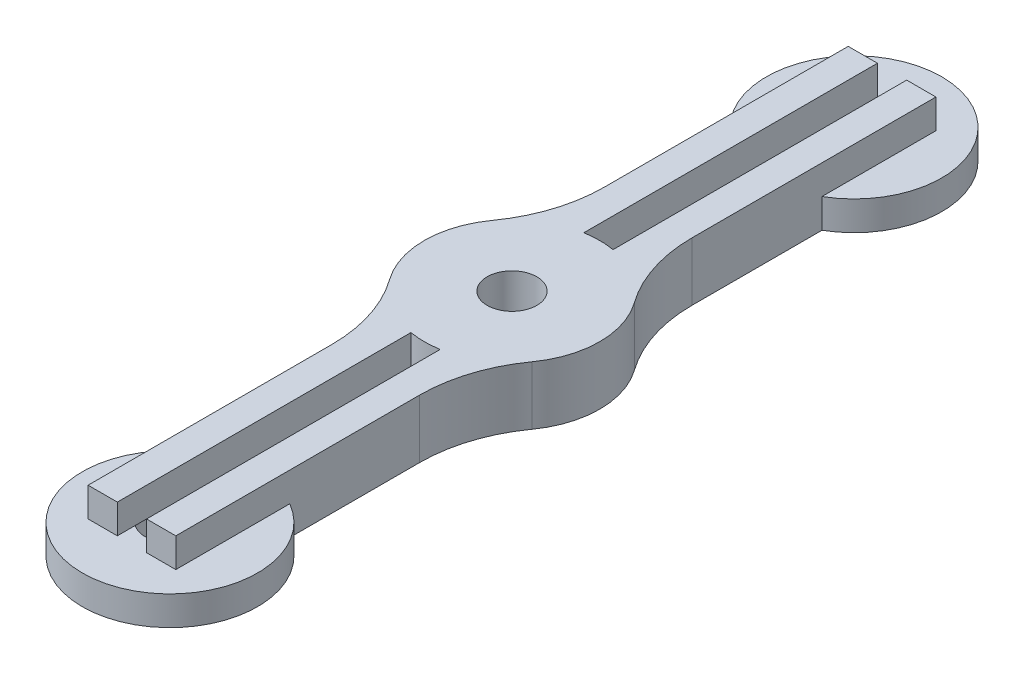
ISO-10303-21;
HEADER;
FILE_DESCRIPTION(('STEP AP214'),'2;1');
FILE_NAME('part.step','',(''),(''),'','','');
FILE_SCHEMA(('AUTOMOTIVE_DESIGN { 1 0 10303 214 1 1 1 1 }'));
ENDSEC;
DATA;
#1=APPLICATION_CONTEXT('core data for automotive mechanical design processes');
#2=APPLICATION_PROTOCOL_DEFINITION('international standard','automotive_design',2000,#1);
#3=PRODUCT_CONTEXT('',#1,'mechanical');
#4=PRODUCT('Part','Part','',(#3));
#5=PRODUCT_RELATED_PRODUCT_CATEGORY('part','',(#4));
#6=PRODUCT_DEFINITION_FORMATION('','',#4);
#7=PRODUCT_DEFINITION_CONTEXT('part definition',#1,'design');
#8=PRODUCT_DEFINITION('design','',#6,#7);
#9=PRODUCT_DEFINITION_SHAPE('','',#8);
#10=(LENGTH_UNIT() NAMED_UNIT(*) SI_UNIT(.MILLI.,.METRE.));
#11=(NAMED_UNIT(*) PLANE_ANGLE_UNIT() SI_UNIT($,.RADIAN.));
#12=(NAMED_UNIT(*) SI_UNIT($,.STERADIAN.) SOLID_ANGLE_UNIT());
#13=UNCERTAINTY_MEASURE_WITH_UNIT(LENGTH_MEASURE(1.E-05),#10,'distance_accuracy_value','');
#14=(GEOMETRIC_REPRESENTATION_CONTEXT(3) GLOBAL_UNCERTAINTY_ASSIGNED_CONTEXT((#13)) GLOBAL_UNIT_ASSIGNED_CONTEXT((#10,
#11,#12)) REPRESENTATION_CONTEXT('',''));
#15=CARTESIAN_POINT('',(0.,0.,0.));
#16=DIRECTION('',(0.,0.,1.));
#17=DIRECTION('',(1.,0.,0.));
#18=AXIS2_PLACEMENT_3D('',#15,#16,#17);
#19=CARTESIAN_POINT('',(0.,2.,0.));
#20=DIRECTION('',(0.,-1.,0.));
#21=DIRECTION('',(0.,0.,-1.));
#22=AXIS2_PLACEMENT_3D('',#19,#20,#21);
#23=CYLINDRICAL_SURFACE('',#22,6.);
#24=CARTESIAN_POINT('',(0.,4.,0.));
#25=DIRECTION('',(0.,1.,0.));
#26=DIRECTION('',(0.,0.,1.));
#27=AXIS2_PLACEMENT_3D('',#24,#25,#26);
#28=CIRCLE('',#27,6.);
#29=CARTESIAN_POINT('',(1.,4.,-5.91607978309962));
#30=VERTEX_POINT('',#29);
#31=CARTESIAN_POINT('',(-1.,4.,-5.91607978309962));
#32=VERTEX_POINT('',#31);
#33=EDGE_CURVE('E448',#30,#32,#28,.T.);
#34=ORIENTED_EDGE('',*,*,#33,.F.);
#35=DIRECTION('',(0.,-1.,0.));
#36=VECTOR('',#35,1.);
#37=CARTESIAN_POINT('',(1.,2.,-5.91607978309962));
#38=LINE('',#37,#36);
#39=CARTESIAN_POINT('',(1.,2.,-5.91607978309962));
#40=VERTEX_POINT('',#39);
#41=EDGE_CURVE('E259',#30,#40,#38,.T.);
#42=ORIENTED_EDGE('',*,*,#41,.T.);
#43=CARTESIAN_POINT('',(0.,2.,0.));
#44=DIRECTION('',(0.,1.,0.));
#45=DIRECTION('',(0.,0.,1.));
#46=AXIS2_PLACEMENT_3D('',#43,#44,#45);
#47=CIRCLE('',#46,6.);
#48=CARTESIAN_POINT('',(-1.,2.,-5.91607978309962));
#49=VERTEX_POINT('',#48);
#50=EDGE_CURVE('E310',#40,#49,#47,.T.);
#51=ORIENTED_EDGE('',*,*,#50,.T.);
#52=DIRECTION('',(0.,-1.,0.));
#53=VECTOR('',#52,1.);
#54=CARTESIAN_POINT('',(-1.,2.,-5.91607978309962));
#55=LINE('',#54,#53);
#56=EDGE_CURVE('E284',#49,#32,#55,.F.);
#57=ORIENTED_EDGE('',*,*,#56,.T.);
#58=EDGE_LOOP('',(#34,#42,#51,#57));
#59=FACE_BOUND('',#58,.T.);
#60=ADVANCED_FACE('F35',(#59),#23,.T.);
#61=CARTESIAN_POINT('',(0.,2.,0.));
#62=DIRECTION('',(0.,1.,0.));
#63=DIRECTION('',(0.,0.,-1.));
#64=AXIS2_PLACEMENT_3D('',#61,#62,#63);
#65=PLANE('',#64);
#66=DIRECTION('',(0.,0.,1.));
#67=VECTOR('',#66,1.);
#68=CARTESIAN_POINT('',(3.,2.,-5.19615242270663));
#69=LINE('',#68,#67);
#70=CARTESIAN_POINT('',(3.,2.,-26.));
#71=VERTEX_POINT('',#70);
#72=CARTESIAN_POINT('',(3.,2.,-18.2038475772934));
#73=VERTEX_POINT('',#72);
#74=EDGE_CURVE('E228',#71,#73,#69,.T.);
#75=ORIENTED_EDGE('',*,*,#74,.T.);
#76=CARTESIAN_POINT('',(0.,2.,-23.4));
#77=DIRECTION('',(0.,-1.,0.));
#78=DIRECTION('',(0.,0.,-1.));
#79=AXIS2_PLACEMENT_3D('',#76,#77,#78);
#80=CIRCLE('',#79,6.);
#81=CARTESIAN_POINT('',(-3.,2.,-18.2038475772934));
#82=VERTEX_POINT('',#81);
#83=EDGE_CURVE('E288',#82,#73,#80,.T.);
#84=ORIENTED_EDGE('',*,*,#83,.F.);
#85=DIRECTION('',(0.,0.,-1.));
#86=VECTOR('',#85,1.);
#87=CARTESIAN_POINT('',(-3.,2.,-26.));
#88=LINE('',#87,#86);
#89=CARTESIAN_POINT('',(-3.,2.,-26.));
#90=VERTEX_POINT('',#89);
#91=EDGE_CURVE('E273',#82,#90,#88,.T.);
#92=ORIENTED_EDGE('',*,*,#91,.T.);
#93=DIRECTION('',(1.,0.,0.));
#94=VECTOR('',#93,1.);
#95=CARTESIAN_POINT('',(-0.999999999999997,2.,-26.));
#96=LINE('',#95,#94);
#97=CARTESIAN_POINT('',(-0.999999999999997,2.,-26.));
#98=VERTEX_POINT('',#97);
#99=EDGE_CURVE('E261',#90,#98,#96,.T.);
#100=ORIENTED_EDGE('',*,*,#99,.T.);
#101=DIRECTION('',(0.,0.,1.));
#102=VECTOR('',#101,1.);
#103=CARTESIAN_POINT('',(-1.,2.,-5.19615242270663));
#104=LINE('',#103,#102);
#105=CARTESIAN_POINT('',(-0.999999999999997,2.,-24.7747727084868));
#106=VERTEX_POINT('',#105);
#107=EDGE_CURVE('E266',#98,#106,#104,.T.);
#108=ORIENTED_EDGE('',*,*,#107,.T.);
#109=CARTESIAN_POINT('',(0.,2.,-23.4));
#110=DIRECTION('',(0.,-1.,0.));
#111=DIRECTION('',(0.,0.,-1.));
#112=AXIS2_PLACEMENT_3D('',#109,#110,#111);
#113=CIRCLE('',#112,1.7);
#114=CARTESIAN_POINT('',(1.,2.,-24.7747727084868));
#115=VERTEX_POINT('',#114);
#116=EDGE_CURVE('E297',#106,#115,#113,.T.);
#117=ORIENTED_EDGE('',*,*,#116,.T.);
#118=DIRECTION('',(0.,0.,-1.));
#119=VECTOR('',#118,1.);
#120=CARTESIAN_POINT('',(1.,2.,-26.));
#121=LINE('',#120,#119);
#122=CARTESIAN_POINT('',(1.,2.,-26.));
#123=VERTEX_POINT('',#122);
#124=EDGE_CURVE('E254',#115,#123,#121,.T.);
#125=ORIENTED_EDGE('',*,*,#124,.T.);
#126=DIRECTION('',(1.,0.,0.));
#127=VECTOR('',#126,1.);
#128=CARTESIAN_POINT('',(3.,2.,-26.));
#129=LINE('',#128,#127);
#130=EDGE_CURVE('E252',#123,#71,#129,.T.);
#131=ORIENTED_EDGE('',*,*,#130,.T.);
#132=EDGE_LOOP('',(#75,#84,#92,#100,#108,#117,#125,#131));
#133=FACE_BOUND('',#132,.T.);
#134=ADVANCED_FACE('F461',(#133),#65,.T.);
#135=CARTESIAN_POINT('',(-4.875,4.,-3.49776714490831));
#136=VERTEX_POINT('',#135);
#137=CARTESIAN_POINT('',(-4.875,4.,3.49776714490831));
#138=VERTEX_POINT('',#137);
#139=EDGE_CURVE('E319',#136,#138,#28,.T.);
#140=ORIENTED_EDGE('',*,*,#139,.F.);
#141=DIRECTION('',(0.,-1.,0.));
#142=VECTOR('',#141,1.);
#143=CARTESIAN_POINT('',(-4.875,2.,-3.49776714490831));
#144=LINE('',#143,#142);
#145=CARTESIAN_POINT('',(-4.875,0.,-3.49776714490831));
#146=VERTEX_POINT('',#145);
#147=EDGE_CURVE('E425',#136,#146,#144,.T.);
#148=ORIENTED_EDGE('',*,*,#147,.T.);
#149=CARTESIAN_POINT('',(0.,0.,0.));
#150=DIRECTION('',(0.,1.,0.));
#151=DIRECTION('',(0.,0.,1.));
#152=AXIS2_PLACEMENT_3D('',#149,#150,#151);
#153=CIRCLE('',#152,6.);
#154=CARTESIAN_POINT('',(-4.875,0.,3.49776714490831));
#155=VERTEX_POINT('',#154);
#156=EDGE_CURVE('E392',#146,#155,#153,.T.);
#157=ORIENTED_EDGE('',*,*,#156,.T.);
#158=DIRECTION('',(0.,-1.,0.));
#159=VECTOR('',#158,1.);
#160=CARTESIAN_POINT('',(-4.875,2.,3.49776714490831));
#161=LINE('',#160,#159);
#162=EDGE_CURVE('E406',#155,#138,#161,.F.);
#163=ORIENTED_EDGE('',*,*,#162,.T.);
#164=EDGE_LOOP('',(#140,#148,#157,#163));
#165=FACE_BOUND('',#164,.T.);
#166=ADVANCED_FACE('F444',(#165),#23,.T.);
#167=CARTESIAN_POINT('',(0.,2.,0.));
#168=DIRECTION('',(0.,1.,0.));
#169=DIRECTION('',(0.,0.,1.));
#170=AXIS2_PLACEMENT_3D('',#167,#168,#169);
#171=PLANE('',#170);
#172=DIRECTION('',(0.,0.,1.));
#173=VECTOR('',#172,1.);
#174=CARTESIAN_POINT('',(1.,2.,26.));
#175=LINE('',#174,#173);
#176=CARTESIAN_POINT('',(1.,2.,5.91607978309962));
#177=VERTEX_POINT('',#176);
#178=CARTESIAN_POINT('',(1.,2.,22.0252272915133));
#179=VERTEX_POINT('',#178);
#180=EDGE_CURVE('E341',#177,#179,#175,.T.);
#181=ORIENTED_EDGE('',*,*,#180,.F.);
#182=CARTESIAN_POINT('',(0.,2.,0.));
#183=DIRECTION('',(0.,1.,0.));
#184=DIRECTION('',(0.,0.,1.));
#185=AXIS2_PLACEMENT_3D('',#182,#183,#184);
#186=CIRCLE('',#185,6.);
#187=CARTESIAN_POINT('',(-1.,2.,5.91607978309962));
#188=VERTEX_POINT('',#187);
#189=EDGE_CURVE('E315',#188,#177,#186,.T.);
#190=ORIENTED_EDGE('',*,*,#189,.F.);
#191=DIRECTION('',(0.,0.,-1.));
#192=VECTOR('',#191,1.);
#193=CARTESIAN_POINT('',(-1.,2.,5.19615242270663));
#194=LINE('',#193,#192);
#195=CARTESIAN_POINT('',(-0.999999999999997,2.,22.0252272915133));
#196=VERTEX_POINT('',#195);
#197=EDGE_CURVE('E364',#196,#188,#194,.T.);
#198=ORIENTED_EDGE('',*,*,#197,.F.);
#199=CARTESIAN_POINT('',(0.,2.,23.4));
#200=DIRECTION('',(0.,1.,0.));
#201=DIRECTION('',(0.,0.,1.));
#202=AXIS2_PLACEMENT_3D('',#199,#200,#201);
#203=CIRCLE('',#202,1.7);
#204=EDGE_CURVE('E378',#179,#196,#203,.T.);
#205=ORIENTED_EDGE('',*,*,#204,.F.);
#206=EDGE_LOOP('',(#181,#190,#198,#205));
#207=FACE_BOUND('',#206,.T.);
#208=ADVANCED_FACE('F480',(#207),#171,.T.);
#209=CARTESIAN_POINT('',(-1.,4.,5.19615242270663));
#210=DIRECTION('',(-1.,0.,0.));
#211=DIRECTION('',(0.,0.,1.));
#212=AXIS2_PLACEMENT_3D('',#209,#210,#211);
#213=PLANE('',#212);
#214=DIRECTION('',(0.,-1.,0.));
#215=VECTOR('',#214,1.);
#216=CARTESIAN_POINT('',(-1.,4.,5.91607978309962));
#217=LINE('',#216,#215);
#218=CARTESIAN_POINT('',(-1.,4.,5.91607978309962));
#219=VERTEX_POINT('',#218);
#220=EDGE_CURVE('E326',#219,#188,#217,.T.);
#221=ORIENTED_EDGE('',*,*,#220,.F.);
#222=DIRECTION('',(0.,0.,-1.));
#223=VECTOR('',#222,1.);
#224=CARTESIAN_POINT('',(-1.,4.,5.19615242270663));
#225=LINE('',#224,#223);
#226=CARTESIAN_POINT('',(-0.999999999999997,4.,26.));
#227=VERTEX_POINT('',#226);
#228=EDGE_CURVE('E352',#227,#219,#225,.T.);
#229=ORIENTED_EDGE('',*,*,#228,.F.);
#230=DIRECTION('',(0.,-1.,0.));
#231=VECTOR('',#230,1.);
#232=CARTESIAN_POINT('',(-0.999999999999997,4.,26.));
#233=LINE('',#232,#231);
#234=CARTESIAN_POINT('',(-0.999999999999997,2.,26.));
#235=VERTEX_POINT('',#234);
#236=EDGE_CURVE('E371',#227,#235,#233,.T.);
#237=ORIENTED_EDGE('',*,*,#236,.T.);
#238=CARTESIAN_POINT('',(-0.999999999999997,2.,24.7747727084868));
#239=VERTEX_POINT('',#238);
#240=EDGE_CURVE('E353',#235,#239,#194,.T.);
#241=ORIENTED_EDGE('',*,*,#240,.T.);
#242=EDGE_CURVE('E361',#239,#196,#194,.T.);
#243=ORIENTED_EDGE('',*,*,#242,.T.);
#244=ORIENTED_EDGE('',*,*,#197,.T.);
#245=EDGE_LOOP('',(#221,#229,#237,#241,#243,#244));
#246=FACE_BOUND('',#245,.T.);
#247=ADVANCED_FACE('F577',(#246),#213,.F.);
#248=CARTESIAN_POINT('',(1.,4.,26.));
#249=DIRECTION('',(1.,0.,0.));
#250=DIRECTION('',(0.,0.,-1.));
#251=AXIS2_PLACEMENT_3D('',#248,#249,#250);
#252=PLANE('',#251);
#253=DIRECTION('',(0.,-1.,0.));
#254=VECTOR('',#253,1.);
#255=CARTESIAN_POINT('',(1.,4.,5.91607978309962));
#256=LINE('',#255,#254);
#257=CARTESIAN_POINT('',(1.,4.,5.91607978309962));
#258=VERTEX_POINT('',#257);
#259=EDGE_CURVE('E323',#177,#258,#256,.F.);
#260=ORIENTED_EDGE('',*,*,#259,.F.);
#261=ORIENTED_EDGE('',*,*,#180,.T.);
#262=CARTESIAN_POINT('',(1.,2.,24.7747727084868));
#263=VERTEX_POINT('',#262);
#264=EDGE_CURVE('E340',#179,#263,#175,.T.);
#265=ORIENTED_EDGE('',*,*,#264,.T.);
#266=DIRECTION('',(0.,0.,-1.));
#267=VECTOR('',#266,1.);
#268=CARTESIAN_POINT('',(1.,2.,0.));
#269=LINE('',#268,#267);
#270=CARTESIAN_POINT('',(1.,2.,26.));
#271=VERTEX_POINT('',#270);
#272=EDGE_CURVE('E368',#271,#263,#269,.T.);
#273=ORIENTED_EDGE('',*,*,#272,.F.);
#274=DIRECTION('',(0.,-1.,0.));
#275=VECTOR('',#274,1.);
#276=CARTESIAN_POINT('',(1.,4.,26.));
#277=LINE('',#276,#275);
#278=CARTESIAN_POINT('',(1.,4.,26.));
#279=VERTEX_POINT('',#278);
#280=EDGE_CURVE('E346',#279,#271,#277,.T.);
#281=ORIENTED_EDGE('',*,*,#280,.F.);
#282=DIRECTION('',(0.,0.,1.));
#283=VECTOR('',#282,1.);
#284=CARTESIAN_POINT('',(1.,4.,26.));
#285=LINE('',#284,#283);
#286=EDGE_CURVE('E333',#258,#279,#285,.T.);
#287=ORIENTED_EDGE('',*,*,#286,.F.);
#288=EDGE_LOOP('',(#260,#261,#265,#273,#281,#287));
#289=FACE_BOUND('',#288,.T.);
#290=ADVANCED_FACE('F573',(#289),#252,.F.);
#291=CARTESIAN_POINT('',(0.,2.,23.4));
#292=DIRECTION('',(0.,1.,0.));
#293=DIRECTION('',(0.,0.,1.));
#294=AXIS2_PLACEMENT_3D('',#291,#292,#293);
#295=CIRCLE('',#294,6.);
#296=CARTESIAN_POINT('',(-3.,2.,18.2038475772934));
#297=VERTEX_POINT('',#296);
#298=CARTESIAN_POINT('',(3.,2.,18.2038475772934));
#299=VERTEX_POINT('',#298);
#300=EDGE_CURVE('E375',#297,#299,#295,.T.);
#301=ORIENTED_EDGE('',*,*,#300,.T.);
#302=DIRECTION('',(0.,0.,-1.));
#303=VECTOR('',#302,1.);
#304=CARTESIAN_POINT('',(3.,2.,5.19615242270663));
#305=LINE('',#304,#303);
#306=CARTESIAN_POINT('',(3.,2.,26.));
#307=VERTEX_POINT('',#306);
#308=EDGE_CURVE('E329',#307,#299,#305,.T.);
#309=ORIENTED_EDGE('',*,*,#308,.F.);
#310=DIRECTION('',(1.,0.,0.));
#311=VECTOR('',#310,1.);
#312=CARTESIAN_POINT('',(3.,2.,26.));
#313=LINE('',#312,#311);
#314=EDGE_CURVE('E334',#271,#307,#313,.T.);
#315=ORIENTED_EDGE('',*,*,#314,.F.);
#316=ORIENTED_EDGE('',*,*,#272,.T.);
#317=EDGE_CURVE('E384',#239,#263,#203,.T.);
#318=ORIENTED_EDGE('',*,*,#317,.F.);
#319=ORIENTED_EDGE('',*,*,#240,.F.);
#320=DIRECTION('',(1.,0.,0.));
#321=VECTOR('',#320,1.);
#322=CARTESIAN_POINT('',(-0.999999999999997,2.,26.));
#323=LINE('',#322,#321);
#324=CARTESIAN_POINT('',(-3.,2.,26.));
#325=VERTEX_POINT('',#324);
#326=EDGE_CURVE('E348',#325,#235,#323,.T.);
#327=ORIENTED_EDGE('',*,*,#326,.F.);
#328=DIRECTION('',(0.,0.,1.));
#329=VECTOR('',#328,1.);
#330=CARTESIAN_POINT('',(-3.,2.,26.));
#331=LINE('',#330,#329);
#332=EDGE_CURVE('E365',#297,#325,#331,.T.);
#333=ORIENTED_EDGE('',*,*,#332,.F.);
#334=EDGE_LOOP('',(#301,#309,#315,#316,#318,#319,#327,#333));
#335=FACE_BOUND('',#334,.T.);
#336=ADVANCED_FACE('F576',(#335),#171,.T.);
#337=CARTESIAN_POINT('',(-3.,2.,0.));
#338=DIRECTION('',(-1.,0.,0.));
#339=DIRECTION('',(0.,0.,1.));
#340=AXIS2_PLACEMENT_3D('',#337,#338,#339);
#341=PLANE('',#340);
#342=DIRECTION('',(0.,0.,1.));
#343=VECTOR('',#342,1.);
#344=CARTESIAN_POINT('',(-3.,4.,26.));
#345=LINE('',#344,#343);
#346=CARTESIAN_POINT('',(-3.,4.,9.32737905308882));
#347=VERTEX_POINT('',#346);
#348=CARTESIAN_POINT('',(-3.,4.,26.));
#349=VERTEX_POINT('',#348);
#350=EDGE_CURVE('E356',#347,#349,#345,.T.);
#351=ORIENTED_EDGE('',*,*,#350,.F.);
#352=DIRECTION('',(0.,-1.,0.));
#353=VECTOR('',#352,1.);
#354=CARTESIAN_POINT('',(-3.,2.,9.32737905308882));
#355=LINE('',#354,#353);
#356=CARTESIAN_POINT('',(-3.,0.,9.32737905308882));
#357=VERTEX_POINT('',#356);
#358=EDGE_CURVE('E413',#347,#357,#355,.T.);
#359=ORIENTED_EDGE('',*,*,#358,.T.);
#360=DIRECTION('',(0.,0.,-1.));
#361=VECTOR('',#360,1.);
#362=CARTESIAN_POINT('',(-3.,0.,0.));
#363=LINE('',#362,#361);
#364=CARTESIAN_POINT('',(-3.,0.,18.2038475772934));
#365=VERTEX_POINT('',#364);
#366=EDGE_CURVE('E374',#365,#357,#363,.T.);
#367=ORIENTED_EDGE('',*,*,#366,.F.);
#368=DIRECTION('',(0.,-1.,0.));
#369=VECTOR('',#368,1.);
#370=CARTESIAN_POINT('',(-3.,2.,18.2038475772934));
#371=LINE('',#370,#369);
#372=EDGE_CURVE('E402',#297,#365,#371,.T.);
#373=ORIENTED_EDGE('',*,*,#372,.F.);
#374=ORIENTED_EDGE('',*,*,#332,.T.);
#375=DIRECTION('',(0.,-1.,0.));
#376=VECTOR('',#375,1.);
#377=CARTESIAN_POINT('',(-3.,4.,26.));
#378=LINE('',#377,#376);
#379=EDGE_CURVE('E358',#349,#325,#378,.T.);
#380=ORIENTED_EDGE('',*,*,#379,.F.);
#381=EDGE_LOOP('',(#351,#359,#367,#373,#374,#380));
#382=FACE_BOUND('',#381,.T.);
#383=ADVANCED_FACE('F803',(#382),#341,.T.);
#384=CARTESIAN_POINT('',(0.,2.,23.4));
#385=DIRECTION('',(0.,-1.,0.));
#386=DIRECTION('',(0.,0.,-1.));
#387=AXIS2_PLACEMENT_3D('',#384,#385,#386);
#388=CYLINDRICAL_SURFACE('',#387,6.);
#389=CARTESIAN_POINT('',(0.,0.,23.4));
#390=DIRECTION('',(0.,1.,0.));
#391=DIRECTION('',(0.,0.,1.));
#392=AXIS2_PLACEMENT_3D('',#389,#390,#391);
#393=CIRCLE('',#392,6.);
#394=CARTESIAN_POINT('',(3.,0.,18.2038475772934));
#395=VERTEX_POINT('',#394);
#396=EDGE_CURVE('E387',#365,#395,#393,.T.);
#397=ORIENTED_EDGE('',*,*,#396,.T.);
#398=DIRECTION('',(0.,-1.,0.));
#399=VECTOR('',#398,1.);
#400=CARTESIAN_POINT('',(3.,2.,18.2038475772934));
#401=LINE('',#400,#399);
#402=EDGE_CURVE('E383',#299,#395,#401,.T.);
#403=ORIENTED_EDGE('',*,*,#402,.F.);
#404=ORIENTED_EDGE('',*,*,#300,.F.);
#405=ORIENTED_EDGE('',*,*,#372,.T.);
#406=EDGE_LOOP('',(#397,#403,#404,#405));
#407=FACE_BOUND('',#406,.T.);
#408=ADVANCED_FACE('F828',(#407),#388,.T.);
#409=CARTESIAN_POINT('',(3.,2.,0.));
#410=DIRECTION('',(-1.,0.,0.));
#411=DIRECTION('',(0.,0.,1.));
#412=AXIS2_PLACEMENT_3D('',#409,#410,#411);
#413=PLANE('',#412);
#414=DIRECTION('',(0.,0.,-1.));
#415=VECTOR('',#414,1.);
#416=CARTESIAN_POINT('',(3.,0.,0.));
#417=LINE('',#416,#415);
#418=CARTESIAN_POINT('',(3.,0.,9.32737905308881));
#419=VERTEX_POINT('',#418);
#420=EDGE_CURVE('E389',#395,#419,#417,.T.);
#421=ORIENTED_EDGE('',*,*,#420,.T.);
#422=DIRECTION('',(0.,1.,0.));
#423=VECTOR('',#422,1.);
#424=CARTESIAN_POINT('',(3.,4.,9.32737905308881));
#425=LINE('',#424,#423);
#426=CARTESIAN_POINT('',(3.,4.,9.32737905308881));
#427=VERTEX_POINT('',#426);
#428=EDGE_CURVE('E411',#419,#427,#425,.T.);
#429=ORIENTED_EDGE('',*,*,#428,.T.);
#430=DIRECTION('',(0.,0.,-1.));
#431=VECTOR('',#430,1.);
#432=CARTESIAN_POINT('',(3.,4.,5.19615242270663));
#433=LINE('',#432,#431);
#434=CARTESIAN_POINT('',(3.,4.,26.));
#435=VERTEX_POINT('',#434);
#436=EDGE_CURVE('E330',#435,#427,#433,.T.);
#437=ORIENTED_EDGE('',*,*,#436,.F.);
#438=DIRECTION('',(0.,-1.,0.));
#439=VECTOR('',#438,1.);
#440=CARTESIAN_POINT('',(3.,4.,26.));
#441=LINE('',#440,#439);
#442=EDGE_CURVE('E338',#435,#307,#441,.T.);
#443=ORIENTED_EDGE('',*,*,#442,.T.);
#444=ORIENTED_EDGE('',*,*,#308,.T.);
#445=ORIENTED_EDGE('',*,*,#402,.T.);
#446=EDGE_LOOP('',(#421,#429,#437,#443,#444,#445));
#447=FACE_BOUND('',#446,.T.);
#448=ADVANCED_FACE('F490',(#447),#413,.F.);
#449=CARTESIAN_POINT('',(0.,2.,23.4));
#450=DIRECTION('',(0.,-1.,0.));
#451=DIRECTION('',(0.,0.,-1.));
#452=AXIS2_PLACEMENT_3D('',#449,#450,#451);
#453=CYLINDRICAL_SURFACE('',#452,1.7);
#454=EDGE_CURVE('E380',#196,#239,#203,.T.);
#455=ORIENTED_EDGE('',*,*,#454,.T.);
#456=ORIENTED_EDGE('',*,*,#317,.T.);
#457=EDGE_CURVE('E916',#263,#179,#203,.T.);
#458=ORIENTED_EDGE('',*,*,#457,.T.);
#459=ORIENTED_EDGE('',*,*,#204,.T.);
#460=EDGE_LOOP('',(#455,#456,#458,#459));
#461=FACE_BOUND('',#460,.T.);
#462=CARTESIAN_POINT('',(0.,0.,23.4));
#463=DIRECTION('',(0.,1.,0.));
#464=DIRECTION('',(0.,0.,1.));
#465=AXIS2_PLACEMENT_3D('',#462,#463,#464);
#466=CIRCLE('',#465,1.7);
#467=CARTESIAN_POINT('',(0.,0.,25.1));
#468=VERTEX_POINT('',#467);
#469=EDGE_CURVE('E395',#468,#468,#466,.T.);
#470=ORIENTED_EDGE('',*,*,#469,.F.);
#471=EDGE_LOOP('',(#470));
#472=FACE_BOUND('',#471,.T.);
#473=ADVANCED_FACE('F483',(#461,#472),#453,.F.);
#474=CARTESIAN_POINT('',(4.875,0.,3.4977671449083));
#475=VERTEX_POINT('',#474);
#476=CARTESIAN_POINT('',(4.875,0.,-3.4977671449083));
#477=VERTEX_POINT('',#476);
#478=EDGE_CURVE('E393',#475,#477,#153,.T.);
#479=ORIENTED_EDGE('',*,*,#478,.T.);
#480=DIRECTION('',(0.,-1.,0.));
#481=VECTOR('',#480,1.);
#482=CARTESIAN_POINT('',(4.875,2.,-3.4977671449083));
#483=LINE('',#482,#481);
#484=CARTESIAN_POINT('',(4.875,4.,-3.4977671449083));
#485=VERTEX_POINT('',#484);
#486=EDGE_CURVE('E56',#477,#485,#483,.F.);
#487=ORIENTED_EDGE('',*,*,#486,.T.);
#488=CARTESIAN_POINT('',(4.875,4.,3.4977671449083));
#489=VERTEX_POINT('',#488);
#490=EDGE_CURVE('E320',#489,#485,#28,.T.);
#491=ORIENTED_EDGE('',*,*,#490,.F.);
#492=DIRECTION('',(0.,-1.,0.));
#493=VECTOR('',#492,1.);
#494=CARTESIAN_POINT('',(4.875,2.,3.4977671449083));
#495=LINE('',#494,#493);
#496=EDGE_CURVE('E409',#489,#475,#495,.T.);
#497=ORIENTED_EDGE('',*,*,#496,.T.);
#498=EDGE_LOOP('',(#479,#487,#491,#497));
#499=FACE_BOUND('',#498,.T.);
#500=ADVANCED_FACE('F471',(#499),#23,.T.);
#501=CARTESIAN_POINT('',(0.,2.,0.));
#502=DIRECTION('',(0.,-1.,0.));
#503=DIRECTION('',(0.,0.,-1.));
#504=AXIS2_PLACEMENT_3D('',#501,#502,#503);
#505=CYLINDRICAL_SURFACE('',#504,1.7);
#506=CARTESIAN_POINT('',(0.,4.,0.));
#507=DIRECTION('',(0.,1.,0.));
#508=DIRECTION('',(0.,0.,1.));
#509=AXIS2_PLACEMENT_3D('',#506,#507,#508);
#510=CIRCLE('',#509,1.7);
#511=CARTESIAN_POINT('',(0.,4.,1.7));
#512=VERTEX_POINT('',#511);
#513=EDGE_CURVE('E312',#512,#512,#510,.T.);
#514=ORIENTED_EDGE('',*,*,#513,.T.);
#515=EDGE_LOOP('',(#514));
#516=FACE_BOUND('',#515,.T.);
#517=CARTESIAN_POINT('',(0.,0.,0.));
#518=DIRECTION('',(0.,1.,0.));
#519=DIRECTION('',(0.,0.,1.));
#520=AXIS2_PLACEMENT_3D('',#517,#518,#519);
#521=CIRCLE('',#520,1.7);
#522=CARTESIAN_POINT('',(0.,0.,1.7));
#523=VERTEX_POINT('',#522);
#524=EDGE_CURVE('E379',#523,#523,#521,.T.);
#525=ORIENTED_EDGE('',*,*,#524,.F.);
#526=EDGE_LOOP('',(#525));
#527=FACE_BOUND('',#526,.T.);
#528=ADVANCED_FACE('F482',(#516,#527),#505,.F.);
#529=CARTESIAN_POINT('',(0.,0.,0.));
#530=DIRECTION('',(0.,1.,0.));
#531=DIRECTION('',(0.,0.,1.));
#532=AXIS2_PLACEMENT_3D('',#529,#530,#531);
#533=PLANE('',#532);
#534=CARTESIAN_POINT('',(-13.,0.,9.32737905308882));
#535=DIRECTION('',(0.,1.,0.));
#536=DIRECTION('',(0.,0.,1.));
#537=AXIS2_PLACEMENT_3D('',#534,#535,#536);
#538=CIRCLE('',#537,10.);
#539=EDGE_CURVE('E420',#357,#155,#538,.T.);
#540=ORIENTED_EDGE('',*,*,#539,.T.);
#541=ORIENTED_EDGE('',*,*,#156,.F.);
#542=CARTESIAN_POINT('',(-13.,0.,-9.32737905308882));
#543=DIRECTION('',(0.,1.,0.));
#544=DIRECTION('',(0.,0.,1.));
#545=AXIS2_PLACEMENT_3D('',#542,#543,#544);
#546=CIRCLE('',#545,10.);
#547=CARTESIAN_POINT('',(-3.,0.,-9.32737905308882));
#548=VERTEX_POINT('',#547);
#549=EDGE_CURVE('E433',#146,#548,#546,.T.);
#550=ORIENTED_EDGE('',*,*,#549,.T.);
#551=DIRECTION('',(0.,0.,1.));
#552=VECTOR('',#551,1.);
#553=CARTESIAN_POINT('',(-3.,0.,0.));
#554=LINE('',#553,#552);
#555=CARTESIAN_POINT('',(-3.,0.,-18.2038475772934));
#556=VERTEX_POINT('',#555);
#557=EDGE_CURVE('E287',#556,#548,#554,.T.);
#558=ORIENTED_EDGE('',*,*,#557,.F.);
#559=CARTESIAN_POINT('',(0.,0.,-23.4));
#560=DIRECTION('',(0.,-1.,0.));
#561=DIRECTION('',(0.,0.,-1.));
#562=AXIS2_PLACEMENT_3D('',#559,#560,#561);
#563=CIRCLE('',#562,6.);
#564=CARTESIAN_POINT('',(3.,0.,-18.2038475772934));
#565=VERTEX_POINT('',#564);
#566=EDGE_CURVE('E302',#556,#565,#563,.T.);
#567=ORIENTED_EDGE('',*,*,#566,.T.);
#568=DIRECTION('',(0.,0.,1.));
#569=VECTOR('',#568,1.);
#570=CARTESIAN_POINT('',(3.,0.,0.));
#571=LINE('',#570,#569);
#572=CARTESIAN_POINT('',(3.,0.,-9.32737905308881));
#573=VERTEX_POINT('',#572);
#574=EDGE_CURVE('E300',#565,#573,#571,.T.);
#575=ORIENTED_EDGE('',*,*,#574,.T.);
#576=CARTESIAN_POINT('',(13.,0.,-9.32737905308881));
#577=DIRECTION('',(0.,1.,0.));
#578=DIRECTION('',(0.,0.,1.));
#579=AXIS2_PLACEMENT_3D('',#576,#577,#578);
#580=CIRCLE('',#579,10.);
#581=EDGE_CURVE('E43',#573,#477,#580,.T.);
#582=ORIENTED_EDGE('',*,*,#581,.T.);
#583=ORIENTED_EDGE('',*,*,#478,.F.);
#584=CARTESIAN_POINT('',(13.,0.,9.32737905308881));
#585=DIRECTION('',(0.,1.,0.));
#586=DIRECTION('',(0.,0.,1.));
#587=AXIS2_PLACEMENT_3D('',#584,#585,#586);
#588=CIRCLE('',#587,10.);
#589=EDGE_CURVE('E416',#475,#419,#588,.T.);
#590=ORIENTED_EDGE('',*,*,#589,.T.);
#591=ORIENTED_EDGE('',*,*,#420,.F.);
#592=ORIENTED_EDGE('',*,*,#396,.F.);
#593=ORIENTED_EDGE('',*,*,#366,.T.);
#594=EDGE_LOOP('',(#540,#541,#550,#558,#567,#575,#582,#583,#590,#591,#592,#593));
#595=FACE_BOUND('',#594,.T.);
#596=ORIENTED_EDGE('',*,*,#469,.T.);
#597=EDGE_LOOP('',(#596));
#598=FACE_BOUND('',#597,.T.);
#599=ORIENTED_EDGE('',*,*,#524,.T.);
#600=EDGE_LOOP('',(#599));
#601=FACE_BOUND('',#600,.T.);
#602=CARTESIAN_POINT('',(0.,0.,-23.4));
#603=DIRECTION('',(0.,-1.,0.));
#604=DIRECTION('',(0.,0.,-1.));
#605=AXIS2_PLACEMENT_3D('',#602,#603,#604);
#606=CIRCLE('',#605,1.7);
#607=CARTESIAN_POINT('',(0.,0.,-25.1));
#608=VERTEX_POINT('',#607);
#609=EDGE_CURVE('E292',#608,#608,#606,.T.);
#610=ORIENTED_EDGE('',*,*,#609,.F.);
#611=EDGE_LOOP('',(#610));
#612=FACE_BOUND('',#611,.T.);
#613=ADVANCED_FACE('F451',(#595,#598,#601,#612),#533,.F.);
#614=CARTESIAN_POINT('',(0.,2.,0.));
#615=DIRECTION('',(0.,-1.,0.));
#616=DIRECTION('',(0.,0.,-1.));
#617=AXIS2_PLACEMENT_3D('',#614,#615,#616);
#618=PLANE('',#617);
#619=ORIENTED_EDGE('',*,*,#454,.F.);
#620=ORIENTED_EDGE('',*,*,#242,.F.);
#621=EDGE_LOOP('',(#619,#620));
#622=FACE_BOUND('',#621,.T.);
#623=ADVANCED_FACE('F582',(#622),#618,.T.);
#624=CARTESIAN_POINT('',(-0.999999999999997,4.,26.));
#625=DIRECTION('',(0.,0.,-1.));
#626=DIRECTION('',(-1.,0.,0.));
#627=AXIS2_PLACEMENT_3D('',#624,#625,#626);
#628=PLANE('',#627);
#629=ORIENTED_EDGE('',*,*,#326,.T.);
#630=ORIENTED_EDGE('',*,*,#236,.F.);
#631=DIRECTION('',(1.,0.,0.));
#632=VECTOR('',#631,1.);
#633=CARTESIAN_POINT('',(-0.999999999999997,4.,26.));
#634=LINE('',#633,#632);
#635=EDGE_CURVE('E349',#349,#227,#634,.T.);
#636=ORIENTED_EDGE('',*,*,#635,.F.);
#637=ORIENTED_EDGE('',*,*,#379,.T.);
#638=EDGE_LOOP('',(#629,#630,#636,#637));
#639=FACE_BOUND('',#638,.T.);
#640=ADVANCED_FACE('F581',(#639),#628,.F.);
#641=CARTESIAN_POINT('',(0.,4.,0.));
#642=DIRECTION('',(0.,-1.,0.));
#643=DIRECTION('',(0.,0.,-1.));
#644=AXIS2_PLACEMENT_3D('',#641,#642,#643);
#645=PLANE('',#644);
#646=ORIENTED_EDGE('',*,*,#490,.T.);
#647=CARTESIAN_POINT('',(13.,4.,-9.32737905308881));
#648=DIRECTION('',(0.,-1.,0.));
#649=DIRECTION('',(0.,0.,-1.));
#650=AXIS2_PLACEMENT_3D('',#647,#648,#649);
#651=CIRCLE('',#650,10.);
#652=CARTESIAN_POINT('',(3.,4.,-9.32737905308881));
#653=VERTEX_POINT('',#652);
#654=EDGE_CURVE('E11',#485,#653,#651,.T.);
#655=ORIENTED_EDGE('',*,*,#654,.T.);
#656=DIRECTION('',(0.,0.,1.));
#657=VECTOR('',#656,1.);
#658=CARTESIAN_POINT('',(3.,4.,-5.19615242270663));
#659=LINE('',#658,#657);
#660=CARTESIAN_POINT('',(3.,4.,-26.));
#661=VERTEX_POINT('',#660);
#662=EDGE_CURVE('E225',#661,#653,#659,.T.);
#663=ORIENTED_EDGE('',*,*,#662,.F.);
#664=DIRECTION('',(1.,0.,0.));
#665=VECTOR('',#664,1.);
#666=CARTESIAN_POINT('',(3.,4.,-26.));
#667=LINE('',#666,#665);
#668=CARTESIAN_POINT('',(1.,4.,-26.));
#669=VERTEX_POINT('',#668);
#670=EDGE_CURVE('E240',#669,#661,#667,.T.);
#671=ORIENTED_EDGE('',*,*,#670,.F.);
#672=DIRECTION('',(0.,0.,-1.));
#673=VECTOR('',#672,1.);
#674=CARTESIAN_POINT('',(1.,4.,-26.));
#675=LINE('',#674,#673);
#676=EDGE_CURVE('E247',#30,#669,#675,.T.);
#677=ORIENTED_EDGE('',*,*,#676,.F.);
#678=ORIENTED_EDGE('',*,*,#33,.T.);
#679=DIRECTION('',(0.,0.,1.));
#680=VECTOR('',#679,1.);
#681=CARTESIAN_POINT('',(-1.,4.,-5.19615242270663));
#682=LINE('',#681,#680);
#683=CARTESIAN_POINT('',(-0.999999999999997,4.,-26.));
#684=VERTEX_POINT('',#683);
#685=EDGE_CURVE('E268',#684,#32,#682,.T.);
#686=ORIENTED_EDGE('',*,*,#685,.F.);
#687=DIRECTION('',(1.,0.,0.));
#688=VECTOR('',#687,1.);
#689=CARTESIAN_POINT('',(-0.999999999999997,4.,-26.));
#690=LINE('',#689,#688);
#691=CARTESIAN_POINT('',(-3.,4.,-26.));
#692=VERTEX_POINT('',#691);
#693=EDGE_CURVE('E262',#692,#684,#690,.T.);
#694=ORIENTED_EDGE('',*,*,#693,.F.);
#695=DIRECTION('',(0.,0.,-1.));
#696=VECTOR('',#695,1.);
#697=CARTESIAN_POINT('',(-3.,4.,-26.));
#698=LINE('',#697,#696);
#699=CARTESIAN_POINT('',(-3.,4.,-9.32737905308882));
#700=VERTEX_POINT('',#699);
#701=EDGE_CURVE('E265',#700,#692,#698,.T.);
#702=ORIENTED_EDGE('',*,*,#701,.F.);
#703=CARTESIAN_POINT('',(-13.,4.,-9.32737905308882));
#704=DIRECTION('',(0.,-1.,0.));
#705=DIRECTION('',(0.,0.,-1.));
#706=AXIS2_PLACEMENT_3D('',#703,#704,#705);
#707=CIRCLE('',#706,10.);
#708=EDGE_CURVE('E435',#700,#136,#707,.T.);
#709=ORIENTED_EDGE('',*,*,#708,.T.);
#710=ORIENTED_EDGE('',*,*,#139,.T.);
#711=CARTESIAN_POINT('',(-13.,4.,9.32737905308882));
#712=DIRECTION('',(0.,-1.,0.));
#713=DIRECTION('',(0.,0.,-1.));
#714=AXIS2_PLACEMENT_3D('',#711,#712,#713);
#715=CIRCLE('',#714,10.);
#716=EDGE_CURVE('E423',#138,#347,#715,.T.);
#717=ORIENTED_EDGE('',*,*,#716,.T.);
#718=ORIENTED_EDGE('',*,*,#350,.T.);
#719=ORIENTED_EDGE('',*,*,#635,.T.);
#720=ORIENTED_EDGE('',*,*,#228,.T.);
#721=EDGE_CURVE('E316',#219,#258,#28,.T.);
#722=ORIENTED_EDGE('',*,*,#721,.T.);
#723=ORIENTED_EDGE('',*,*,#286,.T.);
#724=DIRECTION('',(1.,0.,0.));
#725=VECTOR('',#724,1.);
#726=CARTESIAN_POINT('',(3.,4.,26.));
#727=LINE('',#726,#725);
#728=EDGE_CURVE('E336',#279,#435,#727,.T.);
#729=ORIENTED_EDGE('',*,*,#728,.T.);
#730=ORIENTED_EDGE('',*,*,#436,.T.);
#731=CARTESIAN_POINT('',(13.,4.,9.32737905308881));
#732=DIRECTION('',(0.,-1.,0.));
#733=DIRECTION('',(0.,0.,-1.));
#734=AXIS2_PLACEMENT_3D('',#731,#732,#733);
#735=CIRCLE('',#734,10.);
#736=EDGE_CURVE('E418',#427,#489,#735,.T.);
#737=ORIENTED_EDGE('',*,*,#736,.T.);
#738=EDGE_LOOP('',(#646,#655,#663,#671,#677,#678,#686,#694,#702,#709,#710,#717,#718,#719,#720,
#722,#723,#729,#730,#737));
#739=FACE_BOUND('',#738,.T.);
#740=ORIENTED_EDGE('',*,*,#513,.F.);
#741=EDGE_LOOP('',(#740));
#742=FACE_BOUND('',#741,.T.);
#743=ADVANCED_FACE('F237',(#739,#742),#645,.F.);
#744=CARTESIAN_POINT('',(0.,2.,0.));
#745=DIRECTION('',(0.,-1.,0.));
#746=DIRECTION('',(0.,0.,-1.));
#747=AXIS2_PLACEMENT_3D('',#744,#745,#746);
#748=PLANE('',#747);
#749=ORIENTED_EDGE('',*,*,#264,.F.);
#750=ORIENTED_EDGE('',*,*,#457,.F.);
#751=EDGE_LOOP('',(#749,#750));
#752=FACE_BOUND('',#751,.T.);
#753=ADVANCED_FACE('F566',(#752),#748,.T.);
#754=CARTESIAN_POINT('',(3.,4.,26.));
#755=DIRECTION('',(0.,0.,-1.));
#756=DIRECTION('',(-1.,0.,0.));
#757=AXIS2_PLACEMENT_3D('',#754,#755,#756);
#758=PLANE('',#757);
#759=ORIENTED_EDGE('',*,*,#314,.T.);
#760=ORIENTED_EDGE('',*,*,#442,.F.);
#761=ORIENTED_EDGE('',*,*,#728,.F.);
#762=ORIENTED_EDGE('',*,*,#280,.T.);
#763=EDGE_LOOP('',(#759,#760,#761,#762));
#764=FACE_BOUND('',#763,.T.);
#765=ADVANCED_FACE('F564',(#764),#758,.F.);
#766=CARTESIAN_POINT('',(0.,4.,0.));
#767=DIRECTION('',(0.,-1.,0.));
#768=DIRECTION('',(0.,0.,-1.));
#769=AXIS2_PLACEMENT_3D('',#766,#767,#768);
#770=CYLINDRICAL_SURFACE('',#769,6.);
#771=ORIENTED_EDGE('',*,*,#721,.F.);
#772=ORIENTED_EDGE('',*,*,#220,.T.);
#773=ORIENTED_EDGE('',*,*,#189,.T.);
#774=ORIENTED_EDGE('',*,*,#259,.T.);
#775=EDGE_LOOP('',(#771,#772,#773,#774));
#776=FACE_BOUND('',#775,.T.);
#777=ADVANCED_FACE('F561',(#776),#770,.T.);
#778=CARTESIAN_POINT('',(13.,2.,9.32737905308881));
#779=DIRECTION('',(0.,-1.,0.));
#780=DIRECTION('',(0.,0.,-1.));
#781=AXIS2_PLACEMENT_3D('',#778,#779,#780);
#782=CYLINDRICAL_SURFACE('',#781,10.);
#783=ORIENTED_EDGE('',*,*,#736,.F.);
#784=ORIENTED_EDGE('',*,*,#428,.F.);
#785=ORIENTED_EDGE('',*,*,#589,.F.);
#786=ORIENTED_EDGE('',*,*,#496,.F.);
#787=EDGE_LOOP('',(#783,#784,#785,#786));
#788=FACE_BOUND('',#787,.T.);
#789=ADVANCED_FACE('F502',(#788),#782,.F.);
#790=CARTESIAN_POINT('',(-13.,2.,9.32737905308882));
#791=DIRECTION('',(0.,-1.,0.));
#792=DIRECTION('',(0.,0.,-1.));
#793=AXIS2_PLACEMENT_3D('',#790,#791,#792);
#794=CYLINDRICAL_SURFACE('',#793,10.);
#795=ORIENTED_EDGE('',*,*,#716,.F.);
#796=ORIENTED_EDGE('',*,*,#162,.F.);
#797=ORIENTED_EDGE('',*,*,#539,.F.);
#798=ORIENTED_EDGE('',*,*,#358,.F.);
#799=EDGE_LOOP('',(#795,#796,#797,#798));
#800=FACE_BOUND('',#799,.T.);
#801=ADVANCED_FACE('F552',(#800),#794,.F.);
#802=CARTESIAN_POINT('',(1.,2.,-22.0252272915133));
#803=VERTEX_POINT('',#802);
#804=EDGE_CURVE('E242',#40,#803,#121,.T.);
#805=ORIENTED_EDGE('',*,*,#804,.T.);
#806=CARTESIAN_POINT('',(-0.999999999999998,2.,-22.0252272915133));
#807=VERTEX_POINT('',#806);
#808=EDGE_CURVE('E291',#803,#807,#113,.T.);
#809=ORIENTED_EDGE('',*,*,#808,.T.);
#810=EDGE_CURVE('E275',#807,#49,#104,.T.);
#811=ORIENTED_EDGE('',*,*,#810,.T.);
#812=ORIENTED_EDGE('',*,*,#50,.F.);
#813=EDGE_LOOP('',(#805,#809,#811,#812));
#814=FACE_BOUND('',#813,.T.);
#815=ADVANCED_FACE('F476',(#814),#65,.T.);
#816=CARTESIAN_POINT('',(-3.,2.,0.));
#817=DIRECTION('',(1.,0.,0.));
#818=DIRECTION('',(0.,0.,-1.));
#819=AXIS2_PLACEMENT_3D('',#816,#817,#818);
#820=PLANE('',#819);
#821=ORIENTED_EDGE('',*,*,#557,.T.);
#822=DIRECTION('',(0.,1.,0.));
#823=VECTOR('',#822,1.);
#824=CARTESIAN_POINT('',(-3.,4.,-9.32737905308882));
#825=LINE('',#824,#823);
#826=EDGE_CURVE('E428',#548,#700,#825,.T.);
#827=ORIENTED_EDGE('',*,*,#826,.T.);
#828=ORIENTED_EDGE('',*,*,#701,.T.);
#829=DIRECTION('',(0.,-1.,0.));
#830=VECTOR('',#829,1.);
#831=CARTESIAN_POINT('',(-3.,4.,-26.));
#832=LINE('',#831,#830);
#833=EDGE_CURVE('E281',#692,#90,#832,.T.);
#834=ORIENTED_EDGE('',*,*,#833,.T.);
#835=ORIENTED_EDGE('',*,*,#91,.F.);
#836=DIRECTION('',(0.,-1.,0.));
#837=VECTOR('',#836,1.);
#838=CARTESIAN_POINT('',(-3.,2.,-18.2038475772934));
#839=LINE('',#838,#837);
#840=EDGE_CURVE('E296',#82,#556,#839,.T.);
#841=ORIENTED_EDGE('',*,*,#840,.T.);
#842=EDGE_LOOP('',(#821,#827,#828,#834,#835,#841));
#843=FACE_BOUND('',#842,.T.);
#844=ADVANCED_FACE('F455',(#843),#820,.F.);
#845=CARTESIAN_POINT('',(3.,2.,0.));
#846=DIRECTION('',(1.,0.,0.));
#847=DIRECTION('',(0.,0.,-1.));
#848=AXIS2_PLACEMENT_3D('',#845,#846,#847);
#849=PLANE('',#848);
#850=ORIENTED_EDGE('',*,*,#662,.T.);
#851=DIRECTION('',(0.,-1.,0.));
#852=VECTOR('',#851,1.);
#853=CARTESIAN_POINT('',(3.,2.,-9.32737905308881));
#854=LINE('',#853,#852);
#855=EDGE_CURVE('E430',#653,#573,#854,.T.);
#856=ORIENTED_EDGE('',*,*,#855,.T.);
#857=ORIENTED_EDGE('',*,*,#574,.F.);
#858=DIRECTION('',(0.,-1.,0.));
#859=VECTOR('',#858,1.);
#860=CARTESIAN_POINT('',(3.,2.,-18.2038475772934));
#861=LINE('',#860,#859);
#862=EDGE_CURVE('E308',#73,#565,#861,.T.);
#863=ORIENTED_EDGE('',*,*,#862,.F.);
#864=ORIENTED_EDGE('',*,*,#74,.F.);
#865=DIRECTION('',(0.,-1.,0.));
#866=VECTOR('',#865,1.);
#867=CARTESIAN_POINT('',(3.,4.,-26.));
#868=LINE('',#867,#866);
#869=EDGE_CURVE('E221',#661,#71,#868,.T.);
#870=ORIENTED_EDGE('',*,*,#869,.F.);
#871=EDGE_LOOP('',(#850,#856,#857,#863,#864,#870));
#872=FACE_BOUND('',#871,.T.);
#873=ADVANCED_FACE('F223',(#872),#849,.T.);
#874=CARTESIAN_POINT('',(0.,2.,-23.4));
#875=DIRECTION('',(0.,-1.,0.));
#876=DIRECTION('',(0.,0.,-1.));
#877=AXIS2_PLACEMENT_3D('',#874,#875,#876);
#878=CYLINDRICAL_SURFACE('',#877,1.7);
#879=EDGE_CURVE('E293',#807,#106,#113,.T.);
#880=ORIENTED_EDGE('',*,*,#879,.F.);
#881=ORIENTED_EDGE('',*,*,#808,.F.);
#882=CARTESIAN_POINT('',(0.,2.,-23.4));
#883=DIRECTION('',(0.,-1.,0.));
#884=DIRECTION('',(0.,0.,-1.));
#885=AXIS2_PLACEMENT_3D('',#882,#883,#884);
#886=CIRCLE('',#885,1.7);
#887=EDGE_CURVE('E232',#803,#115,#886,.F.);
#888=ORIENTED_EDGE('',*,*,#887,.T.);
#889=ORIENTED_EDGE('',*,*,#116,.F.);
#890=EDGE_LOOP('',(#880,#881,#888,#889));
#891=FACE_BOUND('',#890,.T.);
#892=ORIENTED_EDGE('',*,*,#609,.T.);
#893=EDGE_LOOP('',(#892));
#894=FACE_BOUND('',#893,.T.);
#895=ADVANCED_FACE('F528',(#891,#894),#878,.F.);
#896=CARTESIAN_POINT('',(0.,2.,-23.4));
#897=DIRECTION('',(0.,-1.,0.));
#898=DIRECTION('',(0.,0.,-1.));
#899=AXIS2_PLACEMENT_3D('',#896,#897,#898);
#900=CYLINDRICAL_SURFACE('',#899,6.);
#901=ORIENTED_EDGE('',*,*,#566,.F.);
#902=ORIENTED_EDGE('',*,*,#840,.F.);
#903=ORIENTED_EDGE('',*,*,#83,.T.);
#904=ORIENTED_EDGE('',*,*,#862,.T.);
#905=EDGE_LOOP('',(#901,#902,#903,#904));
#906=FACE_BOUND('',#905,.T.);
#907=ADVANCED_FACE('F459',(#906),#900,.T.);
#908=CARTESIAN_POINT('',(-1.,4.,-5.19615242270663));
#909=DIRECTION('',(1.,0.,0.));
#910=DIRECTION('',(0.,0.,-1.));
#911=AXIS2_PLACEMENT_3D('',#908,#909,#910);
#912=PLANE('',#911);
#913=ORIENTED_EDGE('',*,*,#56,.F.);
#914=ORIENTED_EDGE('',*,*,#810,.F.);
#915=EDGE_CURVE('E278',#106,#807,#104,.T.);
#916=ORIENTED_EDGE('',*,*,#915,.F.);
#917=ORIENTED_EDGE('',*,*,#107,.F.);
#918=DIRECTION('',(0.,-1.,0.));
#919=VECTOR('',#918,1.);
#920=CARTESIAN_POINT('',(-0.999999999999997,4.,-26.));
#921=LINE('',#920,#919);
#922=EDGE_CURVE('E271',#684,#98,#921,.T.);
#923=ORIENTED_EDGE('',*,*,#922,.F.);
#924=ORIENTED_EDGE('',*,*,#685,.T.);
#925=EDGE_LOOP('',(#913,#914,#916,#917,#923,#924));
#926=FACE_BOUND('',#925,.T.);
#927=ADVANCED_FACE('F510',(#926),#912,.T.);
#928=CARTESIAN_POINT('',(0.,2.,0.));
#929=DIRECTION('',(0.,-1.,0.));
#930=DIRECTION('',(0.,0.,1.));
#931=AXIS2_PLACEMENT_3D('',#928,#929,#930);
#932=PLANE('',#931);
#933=ORIENTED_EDGE('',*,*,#879,.T.);
#934=ORIENTED_EDGE('',*,*,#915,.T.);
#935=EDGE_LOOP('',(#933,#934));
#936=FACE_BOUND('',#935,.T.);
#937=ADVANCED_FACE('F522',(#936),#932,.T.);
#938=CARTESIAN_POINT('',(-0.999999999999997,4.,-26.));
#939=DIRECTION('',(0.,0.,-1.));
#940=DIRECTION('',(-1.,0.,0.));
#941=AXIS2_PLACEMENT_3D('',#938,#939,#940);
#942=PLANE('',#941);
#943=ORIENTED_EDGE('',*,*,#99,.F.);
#944=ORIENTED_EDGE('',*,*,#833,.F.);
#945=ORIENTED_EDGE('',*,*,#693,.T.);
#946=ORIENTED_EDGE('',*,*,#922,.T.);
#947=EDGE_LOOP('',(#943,#944,#945,#946));
#948=FACE_BOUND('',#947,.T.);
#949=ADVANCED_FACE('F516',(#948),#942,.T.);
#950=CARTESIAN_POINT('',(1.,4.,-26.));
#951=DIRECTION('',(-1.,0.,0.));
#952=DIRECTION('',(0.,0.,1.));
#953=AXIS2_PLACEMENT_3D('',#950,#951,#952);
#954=PLANE('',#953);
#955=ORIENTED_EDGE('',*,*,#41,.F.);
#956=ORIENTED_EDGE('',*,*,#676,.T.);
#957=DIRECTION('',(0.,-1.,0.));
#958=VECTOR('',#957,1.);
#959=CARTESIAN_POINT('',(1.,4.,-26.));
#960=LINE('',#959,#958);
#961=EDGE_CURVE('E233',#669,#123,#960,.T.);
#962=ORIENTED_EDGE('',*,*,#961,.T.);
#963=ORIENTED_EDGE('',*,*,#124,.F.);
#964=EDGE_CURVE('E256',#803,#115,#121,.T.);
#965=ORIENTED_EDGE('',*,*,#964,.F.);
#966=ORIENTED_EDGE('',*,*,#804,.F.);
#967=EDGE_LOOP('',(#955,#956,#962,#963,#965,#966));
#968=FACE_BOUND('',#967,.T.);
#969=ADVANCED_FACE('F535',(#968),#954,.T.);
#970=CARTESIAN_POINT('',(0.,2.,0.));
#971=DIRECTION('',(0.,-1.,0.));
#972=DIRECTION('',(0.,0.,1.));
#973=AXIS2_PLACEMENT_3D('',#970,#971,#972);
#974=PLANE('',#973);
#975=ORIENTED_EDGE('',*,*,#887,.F.);
#976=ORIENTED_EDGE('',*,*,#964,.T.);
#977=EDGE_LOOP('',(#975,#976));
#978=FACE_BOUND('',#977,.T.);
#979=ADVANCED_FACE('F533',(#978),#974,.T.);
#980=CARTESIAN_POINT('',(3.,4.,-26.));
#981=DIRECTION('',(0.,0.,-1.));
#982=DIRECTION('',(-1.,0.,0.));
#983=AXIS2_PLACEMENT_3D('',#980,#981,#982);
#984=PLANE('',#983);
#985=ORIENTED_EDGE('',*,*,#130,.F.);
#986=ORIENTED_EDGE('',*,*,#961,.F.);
#987=ORIENTED_EDGE('',*,*,#670,.T.);
#988=ORIENTED_EDGE('',*,*,#869,.T.);
#989=EDGE_LOOP('',(#985,#986,#987,#988));
#990=FACE_BOUND('',#989,.T.);
#991=ADVANCED_FACE('F245',(#990),#984,.T.);
#992=CARTESIAN_POINT('',(-13.,2.,-9.32737905308882));
#993=DIRECTION('',(0.,-1.,0.));
#994=DIRECTION('',(0.,0.,-1.));
#995=AXIS2_PLACEMENT_3D('',#992,#993,#994);
#996=CYLINDRICAL_SURFACE('',#995,10.);
#997=ORIENTED_EDGE('',*,*,#708,.F.);
#998=ORIENTED_EDGE('',*,*,#826,.F.);
#999=ORIENTED_EDGE('',*,*,#549,.F.);
#1000=ORIENTED_EDGE('',*,*,#147,.F.);
#1001=EDGE_LOOP('',(#997,#998,#999,#1000));
#1002=FACE_BOUND('',#1001,.T.);
#1003=ADVANCED_FACE('F449',(#1002),#996,.F.);
#1004=CARTESIAN_POINT('',(13.,2.,-9.32737905308881));
#1005=DIRECTION('',(0.,-1.,0.));
#1006=DIRECTION('',(0.,0.,-1.));
#1007=AXIS2_PLACEMENT_3D('',#1004,#1005,#1006);
#1008=CYLINDRICAL_SURFACE('',#1007,10.);
#1009=ORIENTED_EDGE('',*,*,#654,.F.);
#1010=ORIENTED_EDGE('',*,*,#486,.F.);
#1011=ORIENTED_EDGE('',*,*,#581,.F.);
#1012=ORIENTED_EDGE('',*,*,#855,.F.);
#1013=EDGE_LOOP('',(#1009,#1010,#1011,#1012));
#1014=FACE_BOUND('',#1013,.T.);
#1015=ADVANCED_FACE('F37',(#1014),#1008,.F.);
#1016=CLOSED_SHELL('',(#60,#134,#166,#208,#247,#290,#336,#383,#408,#448,#473,#500,#528,#613,
#623,#640,#743,#753,#765,#777,#789,#801,#815,#844,#873,#895,#907,#927,#937,#949,#969,#979,#991,
#1003,#1015));
#1017=MANIFOLD_SOLID_BREP('B2',#1016);
#1018=ADVANCED_BREP_SHAPE_REPRESENTATION('',(#18,#1017),#14);
#1019=SHAPE_DEFINITION_REPRESENTATION(#9,#1018);
ENDSEC;
END-ISO-10303-21;
